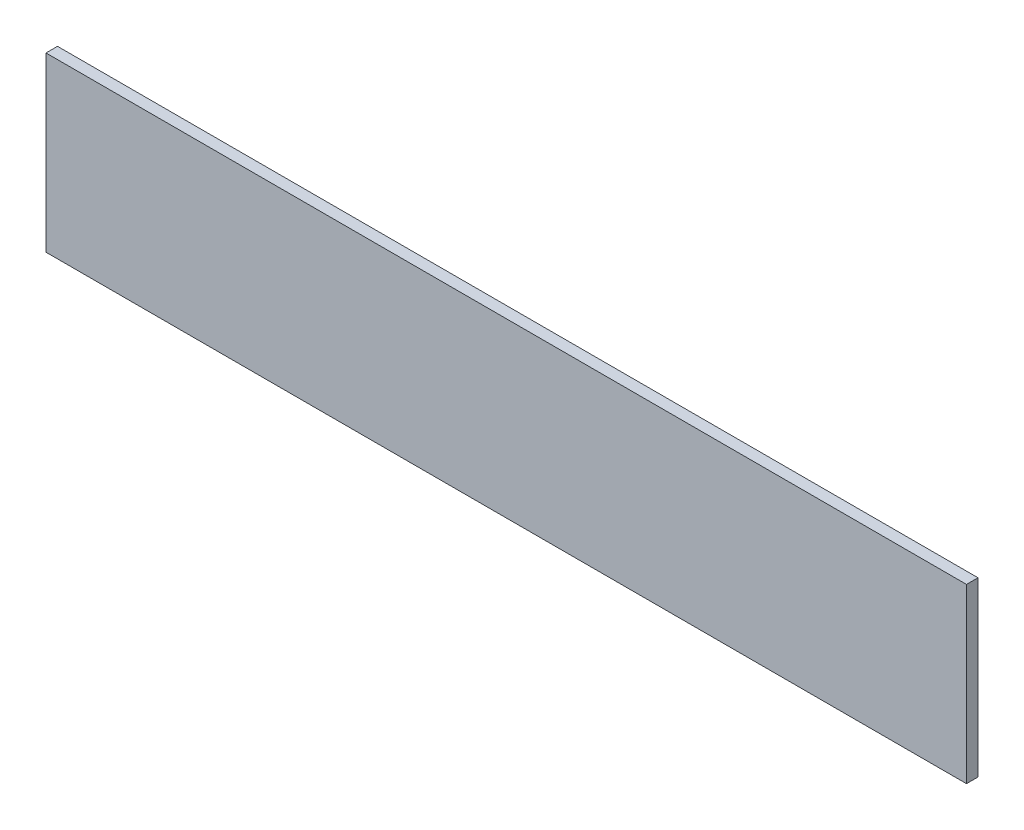
ISO-10303-21;
HEADER;
FILE_DESCRIPTION(('STEP AP214'),'2;1');
FILE_NAME('part.step','',(''),(''),'','','');
FILE_SCHEMA(('AUTOMOTIVE_DESIGN { 1 0 10303 214 1 1 1 1 }'));
ENDSEC;
DATA;
#1=APPLICATION_CONTEXT('core data for automotive mechanical design processes');
#2=APPLICATION_PROTOCOL_DEFINITION('international standard','automotive_design',2000,#1);
#3=PRODUCT_CONTEXT('',#1,'mechanical');
#4=PRODUCT('Part','Part','',(#3));
#5=PRODUCT_RELATED_PRODUCT_CATEGORY('part','',(#4));
#6=PRODUCT_DEFINITION_FORMATION('','',#4);
#7=PRODUCT_DEFINITION_CONTEXT('part definition',#1,'design');
#8=PRODUCT_DEFINITION('design','',#6,#7);
#9=PRODUCT_DEFINITION_SHAPE('','',#8);
#10=(LENGTH_UNIT() NAMED_UNIT(*) SI_UNIT(.MILLI.,.METRE.));
#11=(NAMED_UNIT(*) PLANE_ANGLE_UNIT() SI_UNIT($,.RADIAN.));
#12=(NAMED_UNIT(*) SI_UNIT($,.STERADIAN.) SOLID_ANGLE_UNIT());
#13=UNCERTAINTY_MEASURE_WITH_UNIT(LENGTH_MEASURE(1.E-05),#10,'distance_accuracy_value','');
#14=(GEOMETRIC_REPRESENTATION_CONTEXT(3) GLOBAL_UNCERTAINTY_ASSIGNED_CONTEXT((#13)) GLOBAL_UNIT_ASSIGNED_CONTEXT((#10,
#11,#12)) REPRESENTATION_CONTEXT('',''));
#15=CARTESIAN_POINT('',(0.,0.,0.));
#16=DIRECTION('',(0.,0.,1.));
#17=DIRECTION('',(1.,0.,0.));
#18=AXIS2_PLACEMENT_3D('',#15,#16,#17);
#19=CARTESIAN_POINT('',(0.,0.,2.));
#20=DIRECTION('',(1.,0.,0.));
#21=DIRECTION('',(0.,0.,-1.));
#22=AXIS2_PLACEMENT_3D('',#19,#20,#21);
#23=PLANE('',#22);
#24=DIRECTION('',(0.,-1.,0.));
#25=VECTOR('',#24,1.);
#26=CARTESIAN_POINT('',(0.,0.,0.));
#27=LINE('',#26,#25);
#28=CARTESIAN_POINT('',(0.,30.,0.));
#29=VERTEX_POINT('',#28);
#30=CARTESIAN_POINT('',(0.,0.,0.));
#31=VERTEX_POINT('',#30);
#32=EDGE_CURVE('E169',#29,#31,#27,.T.);
#33=ORIENTED_EDGE('',*,*,#32,.T.);
#34=DIRECTION('',(0.,0.,-1.));
#35=VECTOR('',#34,1.);
#36=CARTESIAN_POINT('',(0.,0.,2.));
#37=LINE('',#36,#35);
#38=CARTESIAN_POINT('',(0.,0.,2.));
#39=VERTEX_POINT('',#38);
#40=EDGE_CURVE('E12',#39,#31,#37,.T.);
#41=ORIENTED_EDGE('',*,*,#40,.F.);
#42=DIRECTION('',(0.,-1.,0.));
#43=VECTOR('',#42,1.);
#44=CARTESIAN_POINT('',(0.,0.,2.));
#45=LINE('',#44,#43);
#46=CARTESIAN_POINT('',(0.,30.,2.));
#47=VERTEX_POINT('',#46);
#48=EDGE_CURVE('E97',#47,#39,#45,.T.);
#49=ORIENTED_EDGE('',*,*,#48,.F.);
#50=DIRECTION('',(0.,0.,-1.));
#51=VECTOR('',#50,1.);
#52=CARTESIAN_POINT('',(0.,30.,2.));
#53=LINE('',#52,#51);
#54=EDGE_CURVE('E110',#47,#29,#53,.T.);
#55=ORIENTED_EDGE('',*,*,#54,.T.);
#56=EDGE_LOOP('',(#33,#41,#49,#55));
#57=FACE_BOUND('',#56,.T.);
#58=ADVANCED_FACE('F44',(#57),#23,.F.);
#59=CARTESIAN_POINT('',(0.,0.,2.));
#60=DIRECTION('',(0.,1.,0.));
#61=DIRECTION('',(0.,0.,1.));
#62=AXIS2_PLACEMENT_3D('',#59,#60,#61);
#63=PLANE('',#62);
#64=DIRECTION('',(1.,0.,0.));
#65=VECTOR('',#64,1.);
#66=CARTESIAN_POINT('',(0.,0.,0.));
#67=LINE('',#66,#65);
#68=CARTESIAN_POINT('',(160.,0.,0.));
#69=VERTEX_POINT('',#68);
#70=EDGE_CURVE('E102',#31,#69,#67,.T.);
#71=ORIENTED_EDGE('',*,*,#70,.T.);
#72=DIRECTION('',(0.,0.,-1.));
#73=VECTOR('',#72,1.);
#74=CARTESIAN_POINT('',(160.,0.,2.));
#75=LINE('',#74,#73);
#76=CARTESIAN_POINT('',(160.,0.,2.));
#77=VERTEX_POINT('',#76);
#78=EDGE_CURVE('E53',#77,#69,#75,.T.);
#79=ORIENTED_EDGE('',*,*,#78,.F.);
#80=DIRECTION('',(1.,0.,0.));
#81=VECTOR('',#80,1.);
#82=CARTESIAN_POINT('',(0.,0.,2.));
#83=LINE('',#82,#81);
#84=EDGE_CURVE('E91',#39,#77,#83,.T.);
#85=ORIENTED_EDGE('',*,*,#84,.F.);
#86=ORIENTED_EDGE('',*,*,#40,.T.);
#87=EDGE_LOOP('',(#71,#79,#85,#86));
#88=FACE_BOUND('',#87,.T.);
#89=ADVANCED_FACE('F101',(#88),#63,.F.);
#90=CARTESIAN_POINT('',(160.,0.,2.));
#91=DIRECTION('',(-1.,0.,0.));
#92=DIRECTION('',(0.,0.,1.));
#93=AXIS2_PLACEMENT_3D('',#90,#91,#92);
#94=PLANE('',#93);
#95=DIRECTION('',(0.,1.,0.));
#96=VECTOR('',#95,1.);
#97=CARTESIAN_POINT('',(160.,0.,0.));
#98=LINE('',#97,#96);
#99=CARTESIAN_POINT('',(160.,30.,0.));
#100=VERTEX_POINT('',#99);
#101=EDGE_CURVE('E78',#69,#100,#98,.T.);
#102=ORIENTED_EDGE('',*,*,#101,.T.);
#103=DIRECTION('',(0.,0.,-1.));
#104=VECTOR('',#103,1.);
#105=CARTESIAN_POINT('',(160.,30.,2.));
#106=LINE('',#105,#104);
#107=CARTESIAN_POINT('',(160.,30.,2.));
#108=VERTEX_POINT('',#107);
#109=EDGE_CURVE('E104',#108,#100,#106,.T.);
#110=ORIENTED_EDGE('',*,*,#109,.F.);
#111=DIRECTION('',(0.,1.,0.));
#112=VECTOR('',#111,1.);
#113=CARTESIAN_POINT('',(160.,0.,2.));
#114=LINE('',#113,#112);
#115=EDGE_CURVE('E95',#77,#108,#114,.T.);
#116=ORIENTED_EDGE('',*,*,#115,.F.);
#117=ORIENTED_EDGE('',*,*,#78,.T.);
#118=EDGE_LOOP('',(#102,#110,#116,#117));
#119=FACE_BOUND('',#118,.T.);
#120=ADVANCED_FACE('F105',(#119),#94,.F.);
#121=CARTESIAN_POINT('',(0.,30.,2.));
#122=DIRECTION('',(0.,-1.,0.));
#123=DIRECTION('',(0.,0.,-1.));
#124=AXIS2_PLACEMENT_3D('',#121,#122,#123);
#125=PLANE('',#124);
#126=DIRECTION('',(-1.,0.,0.));
#127=VECTOR('',#126,1.);
#128=CARTESIAN_POINT('',(0.,30.,0.));
#129=LINE('',#128,#127);
#130=EDGE_CURVE('E84',#100,#29,#129,.T.);
#131=ORIENTED_EDGE('',*,*,#130,.T.);
#132=ORIENTED_EDGE('',*,*,#54,.F.);
#133=DIRECTION('',(-1.,0.,0.));
#134=VECTOR('',#133,1.);
#135=CARTESIAN_POINT('',(0.,30.,2.));
#136=LINE('',#135,#134);
#137=EDGE_CURVE('E61',#108,#47,#136,.T.);
#138=ORIENTED_EDGE('',*,*,#137,.F.);
#139=ORIENTED_EDGE('',*,*,#109,.T.);
#140=EDGE_LOOP('',(#131,#132,#138,#139));
#141=FACE_BOUND('',#140,.T.);
#142=ADVANCED_FACE('F164',(#141),#125,.F.);
#143=CARTESIAN_POINT('',(0.,0.,2.));
#144=DIRECTION('',(0.,0.,-1.));
#145=DIRECTION('',(-1.,0.,0.));
#146=AXIS2_PLACEMENT_3D('',#143,#144,#145);
#147=PLANE('',#146);
#148=ORIENTED_EDGE('',*,*,#48,.T.);
#149=ORIENTED_EDGE('',*,*,#84,.T.);
#150=ORIENTED_EDGE('',*,*,#115,.T.);
#151=ORIENTED_EDGE('',*,*,#137,.T.);
#152=EDGE_LOOP('',(#148,#149,#150,#151));
#153=FACE_BOUND('',#152,.T.);
#154=ADVANCED_FACE('F93',(#153),#147,.F.);
#155=CARTESIAN_POINT('',(0.,0.,0.));
#156=DIRECTION('',(0.,0.,-1.));
#157=DIRECTION('',(-1.,0.,0.));
#158=AXIS2_PLACEMENT_3D('',#155,#156,#157);
#159=PLANE('',#158);
#160=ORIENTED_EDGE('',*,*,#32,.F.);
#161=ORIENTED_EDGE('',*,*,#130,.F.);
#162=ORIENTED_EDGE('',*,*,#101,.F.);
#163=ORIENTED_EDGE('',*,*,#70,.F.);
#164=EDGE_LOOP('',(#160,#161,#162,#163));
#165=FACE_BOUND('',#164,.T.);
#166=ADVANCED_FACE('F167',(#165),#159,.T.);
#167=CLOSED_SHELL('',(#58,#89,#120,#142,#154,#166));
#168=MANIFOLD_SOLID_BREP('B2',#167);
#169=ADVANCED_BREP_SHAPE_REPRESENTATION('',(#18,#168),#14);
#170=SHAPE_DEFINITION_REPRESENTATION(#9,#169);
ENDSEC;
END-ISO-10303-21;
